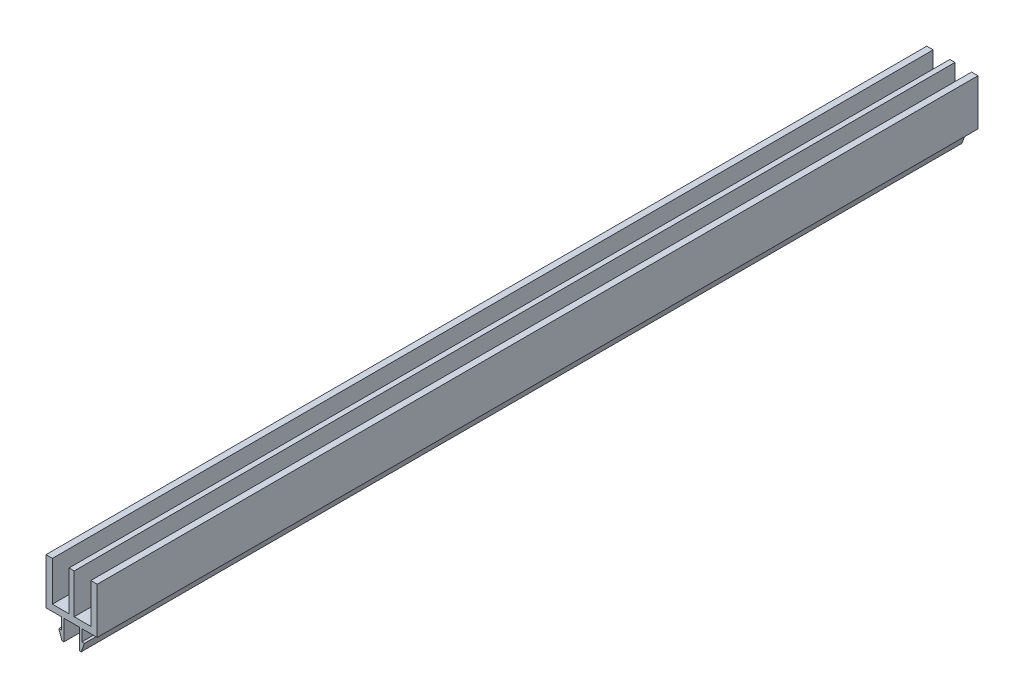
ISO-10303-21;
HEADER;
FILE_DESCRIPTION(('STEP AP214'),'2;1');
FILE_NAME('part.step','',(''),(''),'','','');
FILE_SCHEMA(('AUTOMOTIVE_DESIGN { 1 0 10303 214 1 1 1 1 }'));
ENDSEC;
DATA;
#1=APPLICATION_CONTEXT('core data for automotive mechanical design processes');
#2=APPLICATION_PROTOCOL_DEFINITION('international standard','automotive_design',2000,#1);
#3=PRODUCT_CONTEXT('',#1,'mechanical');
#4=PRODUCT('Part','Part','',(#3));
#5=PRODUCT_RELATED_PRODUCT_CATEGORY('part','',(#4));
#6=PRODUCT_DEFINITION_FORMATION('','',#4);
#7=PRODUCT_DEFINITION_CONTEXT('part definition',#1,'design');
#8=PRODUCT_DEFINITION('design','',#6,#7);
#9=PRODUCT_DEFINITION_SHAPE('','',#8);
#10=(LENGTH_UNIT() NAMED_UNIT(*) SI_UNIT(.MILLI.,.METRE.));
#11=(NAMED_UNIT(*) PLANE_ANGLE_UNIT() SI_UNIT($,.RADIAN.));
#12=(NAMED_UNIT(*) SI_UNIT($,.STERADIAN.) SOLID_ANGLE_UNIT());
#13=UNCERTAINTY_MEASURE_WITH_UNIT(LENGTH_MEASURE(1.E-05),#10,'distance_accuracy_value','');
#14=(GEOMETRIC_REPRESENTATION_CONTEXT(3) GLOBAL_UNCERTAINTY_ASSIGNED_CONTEXT((#13)) GLOBAL_UNIT_ASSIGNED_CONTEXT((#10,
#11,#12)) REPRESENTATION_CONTEXT('',''));
#15=CARTESIAN_POINT('',(0.,0.,0.));
#16=DIRECTION('',(0.,0.,1.));
#17=DIRECTION('',(1.,0.,0.));
#18=AXIS2_PLACEMENT_3D('',#15,#16,#17);
#19=CARTESIAN_POINT('',(-1.,17.9999999975,-294.));
#20=DIRECTION('',(-1.,0.,0.));
#21=DIRECTION('',(0.,-1.,0.));
#22=AXIS2_PLACEMENT_3D('',#19,#20,#21);
#23=PLANE('',#22);
#24=DIRECTION('',(0.,-1.,0.));
#25=VECTOR('',#24,1.);
#26=CARTESIAN_POINT('',(-1.,17.9999999975,50.));
#27=LINE('',#26,#25);
#28=CARTESIAN_POINT('',(-1.,17.9999999975,50.));
#29=VERTEX_POINT('',#28);
#30=CARTESIAN_POINT('',(-1.,2.4999999995,50.));
#31=VERTEX_POINT('',#30);
#32=EDGE_CURVE('E225',#29,#31,#27,.T.);
#33=ORIENTED_EDGE('',*,*,#32,.F.);
#34=DIRECTION('',(0.,0.,1.));
#35=VECTOR('',#34,1.);
#36=CARTESIAN_POINT('',(-1.,17.9999999975,-294.));
#37=LINE('',#36,#35);
#38=CARTESIAN_POINT('',(-1.,17.9999999975,-294.));
#39=VERTEX_POINT('',#38);
#40=EDGE_CURVE('E11',#39,#29,#37,.T.);
#41=ORIENTED_EDGE('',*,*,#40,.F.);
#42=DIRECTION('',(0.,-1.,0.));
#43=VECTOR('',#42,1.);
#44=CARTESIAN_POINT('',(-1.,17.9999999975,-294.));
#45=LINE('',#44,#43);
#46=CARTESIAN_POINT('',(-1.,2.4999999995,-294.));
#47=VERTEX_POINT('',#46);
#48=EDGE_CURVE('E293',#39,#47,#45,.T.);
#49=ORIENTED_EDGE('',*,*,#48,.T.);
#50=DIRECTION('',(0.,0.,1.));
#51=VECTOR('',#50,1.);
#52=CARTESIAN_POINT('',(-1.,2.4999999995,-294.));
#53=LINE('',#52,#51);
#54=EDGE_CURVE('E35',#47,#31,#53,.T.);
#55=ORIENTED_EDGE('',*,*,#54,.T.);
#56=EDGE_LOOP('',(#33,#41,#49,#55));
#57=FACE_BOUND('',#56,.T.);
#58=ADVANCED_FACE('F32',(#57),#23,.T.);
#59=CARTESIAN_POINT('',(0.999999999999998,17.9999999975,-294.));
#60=DIRECTION('',(0.,1.,0.));
#61=DIRECTION('',(0.,0.,1.));
#62=AXIS2_PLACEMENT_3D('',#59,#60,#61);
#63=PLANE('',#62);
#64=DIRECTION('',(-1.,0.,0.));
#65=VECTOR('',#64,1.);
#66=CARTESIAN_POINT('',(0.999999999999998,17.9999999975,50.));
#67=LINE('',#66,#65);
#68=CARTESIAN_POINT('',(0.999999999999998,17.9999999975,50.));
#69=VERTEX_POINT('',#68);
#70=EDGE_CURVE('E291',#69,#29,#67,.T.);
#71=ORIENTED_EDGE('',*,*,#70,.F.);
#72=DIRECTION('',(0.,0.,1.));
#73=VECTOR('',#72,1.);
#74=CARTESIAN_POINT('',(0.999999999999998,17.9999999975,-294.));
#75=LINE('',#74,#73);
#76=CARTESIAN_POINT('',(0.999999999999998,17.9999999975,-294.));
#77=VERTEX_POINT('',#76);
#78=EDGE_CURVE('E41',#77,#69,#75,.T.);
#79=ORIENTED_EDGE('',*,*,#78,.F.);
#80=DIRECTION('',(-1.,0.,0.));
#81=VECTOR('',#80,1.);
#82=CARTESIAN_POINT('',(0.999999999999998,17.9999999975,-294.));
#83=LINE('',#82,#81);
#84=EDGE_CURVE('E215',#77,#39,#83,.T.);
#85=ORIENTED_EDGE('',*,*,#84,.T.);
#86=ORIENTED_EDGE('',*,*,#40,.T.);
#87=EDGE_LOOP('',(#71,#79,#85,#86));
#88=FACE_BOUND('',#87,.T.);
#89=ADVANCED_FACE('F337',(#88),#63,.T.);
#90=CARTESIAN_POINT('',(0.999999999999998,2.4999999995,-294.));
#91=DIRECTION('',(1.,0.,0.));
#92=DIRECTION('',(0.,0.,-1.));
#93=AXIS2_PLACEMENT_3D('',#90,#91,#92);
#94=PLANE('',#93);
#95=DIRECTION('',(0.,1.,0.));
#96=VECTOR('',#95,1.);
#97=CARTESIAN_POINT('',(0.999999999999998,2.4999999995,50.));
#98=LINE('',#97,#96);
#99=CARTESIAN_POINT('',(0.999999999999998,2.4999999995,50.));
#100=VERTEX_POINT('',#99);
#101=EDGE_CURVE('E202',#100,#69,#98,.T.);
#102=ORIENTED_EDGE('',*,*,#101,.F.);
#103=DIRECTION('',(0.,0.,1.));
#104=VECTOR('',#103,1.);
#105=CARTESIAN_POINT('',(0.999999999999998,2.4999999995,-294.));
#106=LINE('',#105,#104);
#107=CARTESIAN_POINT('',(0.999999999999998,2.4999999995,-294.));
#108=VERTEX_POINT('',#107);
#109=EDGE_CURVE('E197',#108,#100,#106,.T.);
#110=ORIENTED_EDGE('',*,*,#109,.F.);
#111=DIRECTION('',(0.,1.,0.));
#112=VECTOR('',#111,1.);
#113=CARTESIAN_POINT('',(0.999999999999998,2.4999999995,-294.));
#114=LINE('',#113,#112);
#115=EDGE_CURVE('E200',#108,#77,#114,.T.);
#116=ORIENTED_EDGE('',*,*,#115,.T.);
#117=ORIENTED_EDGE('',*,*,#78,.T.);
#118=EDGE_LOOP('',(#102,#110,#116,#117));
#119=FACE_BOUND('',#118,.T.);
#120=ADVANCED_FACE('F199',(#119),#94,.T.);
#121=CARTESIAN_POINT('',(7.5,2.4999999995,-294.));
#122=DIRECTION('',(0.,1.,0.));
#123=DIRECTION('',(-1.,0.,0.));
#124=AXIS2_PLACEMENT_3D('',#121,#122,#123);
#125=PLANE('',#124);
#126=DIRECTION('',(-1.,0.,0.));
#127=VECTOR('',#126,1.);
#128=CARTESIAN_POINT('',(7.5,2.4999999995,50.));
#129=LINE('',#128,#127);
#130=CARTESIAN_POINT('',(7.5,2.4999999995,50.));
#131=VERTEX_POINT('',#130);
#132=EDGE_CURVE('E288',#131,#100,#129,.T.);
#133=ORIENTED_EDGE('',*,*,#132,.F.);
#134=DIRECTION('',(0.,0.,1.));
#135=VECTOR('',#134,1.);
#136=CARTESIAN_POINT('',(7.5,2.4999999995,-294.));
#137=LINE('',#136,#135);
#138=CARTESIAN_POINT('',(7.5,2.4999999995,-294.));
#139=VERTEX_POINT('',#138);
#140=EDGE_CURVE('E207',#139,#131,#137,.T.);
#141=ORIENTED_EDGE('',*,*,#140,.F.);
#142=DIRECTION('',(-1.,0.,0.));
#143=VECTOR('',#142,1.);
#144=CARTESIAN_POINT('',(7.5,2.4999999995,-294.));
#145=LINE('',#144,#143);
#146=EDGE_CURVE('E213',#139,#108,#145,.T.);
#147=ORIENTED_EDGE('',*,*,#146,.T.);
#148=ORIENTED_EDGE('',*,*,#109,.T.);
#149=EDGE_LOOP('',(#133,#141,#147,#148));
#150=FACE_BOUND('',#149,.T.);
#151=ADVANCED_FACE('F217',(#150),#125,.T.);
#152=CARTESIAN_POINT('',(7.5,17.9999999975,-294.));
#153=DIRECTION('',(-1.,0.,0.));
#154=DIRECTION('',(0.,-1.,0.));
#155=AXIS2_PLACEMENT_3D('',#152,#153,#154);
#156=PLANE('',#155);
#157=DIRECTION('',(0.,-1.,0.));
#158=VECTOR('',#157,1.);
#159=CARTESIAN_POINT('',(7.5,17.9999999975,50.));
#160=LINE('',#159,#158);
#161=CARTESIAN_POINT('',(7.5,17.9999999975,50.));
#162=VERTEX_POINT('',#161);
#163=EDGE_CURVE('E285',#162,#131,#160,.T.);
#164=ORIENTED_EDGE('',*,*,#163,.F.);
#165=DIRECTION('',(0.,0.,1.));
#166=VECTOR('',#165,1.);
#167=CARTESIAN_POINT('',(7.5,17.9999999975,-294.));
#168=LINE('',#167,#166);
#169=CARTESIAN_POINT('',(7.5,17.9999999975,-294.));
#170=VERTEX_POINT('',#169);
#171=EDGE_CURVE('E297',#170,#162,#168,.T.);
#172=ORIENTED_EDGE('',*,*,#171,.F.);
#173=DIRECTION('',(0.,-1.,0.));
#174=VECTOR('',#173,1.);
#175=CARTESIAN_POINT('',(7.5,17.9999999975,-294.));
#176=LINE('',#175,#174);
#177=EDGE_CURVE('E218',#170,#139,#176,.T.);
#178=ORIENTED_EDGE('',*,*,#177,.T.);
#179=ORIENTED_EDGE('',*,*,#140,.T.);
#180=EDGE_LOOP('',(#164,#172,#178,#179));
#181=FACE_BOUND('',#180,.T.);
#182=ADVANCED_FACE('F350',(#181),#156,.T.);
#183=CARTESIAN_POINT('',(10.,17.9999999975,-294.));
#184=DIRECTION('',(0.,1.,0.));
#185=DIRECTION('',(0.,0.,1.));
#186=AXIS2_PLACEMENT_3D('',#183,#184,#185);
#187=PLANE('',#186);
#188=DIRECTION('',(-1.,0.,0.));
#189=VECTOR('',#188,1.);
#190=CARTESIAN_POINT('',(10.,17.9999999975,50.));
#191=LINE('',#190,#189);
#192=CARTESIAN_POINT('',(10.,17.9999999975,50.));
#193=VERTEX_POINT('',#192);
#194=EDGE_CURVE('E282',#193,#162,#191,.T.);
#195=ORIENTED_EDGE('',*,*,#194,.F.);
#196=DIRECTION('',(0.,0.,1.));
#197=VECTOR('',#196,1.);
#198=CARTESIAN_POINT('',(10.,17.9999999975,-294.));
#199=LINE('',#198,#197);
#200=CARTESIAN_POINT('',(10.,17.9999999975,-294.));
#201=VERTEX_POINT('',#200);
#202=EDGE_CURVE('E299',#201,#193,#199,.T.);
#203=ORIENTED_EDGE('',*,*,#202,.F.);
#204=DIRECTION('',(-1.,0.,0.));
#205=VECTOR('',#204,1.);
#206=CARTESIAN_POINT('',(10.,17.9999999975,-294.));
#207=LINE('',#206,#205);
#208=EDGE_CURVE('E220',#201,#170,#207,.T.);
#209=ORIENTED_EDGE('',*,*,#208,.T.);
#210=ORIENTED_EDGE('',*,*,#171,.T.);
#211=EDGE_LOOP('',(#195,#203,#209,#210));
#212=FACE_BOUND('',#211,.T.);
#213=ADVANCED_FACE('F353',(#212),#187,.T.);
#214=CARTESIAN_POINT('',(10.,-4.99999828349541E-10,-294.));
#215=DIRECTION('',(1.,0.,0.));
#216=DIRECTION('',(0.,0.,-1.));
#217=AXIS2_PLACEMENT_3D('',#214,#215,#216);
#218=PLANE('',#217);
#219=DIRECTION('',(0.,1.,0.));
#220=VECTOR('',#219,1.);
#221=CARTESIAN_POINT('',(10.,-4.99999828349541E-10,50.));
#222=LINE('',#221,#220);
#223=CARTESIAN_POINT('',(10.,-4.99999828349541E-10,50.));
#224=VERTEX_POINT('',#223);
#225=EDGE_CURVE('E279',#224,#193,#222,.T.);
#226=ORIENTED_EDGE('',*,*,#225,.F.);
#227=DIRECTION('',(0.,0.,1.));
#228=VECTOR('',#227,1.);
#229=CARTESIAN_POINT('',(10.,-4.99999828349541E-10,-294.));
#230=LINE('',#229,#228);
#231=CARTESIAN_POINT('',(10.,-4.99999828349541E-10,-294.));
#232=VERTEX_POINT('',#231);
#233=EDGE_CURVE('E301',#232,#224,#230,.T.);
#234=ORIENTED_EDGE('',*,*,#233,.F.);
#235=DIRECTION('',(0.,1.,0.));
#236=VECTOR('',#235,1.);
#237=CARTESIAN_POINT('',(10.,-4.99999828349541E-10,-294.));
#238=LINE('',#237,#236);
#239=EDGE_CURVE('E643',#232,#201,#238,.T.);
#240=ORIENTED_EDGE('',*,*,#239,.T.);
#241=ORIENTED_EDGE('',*,*,#202,.T.);
#242=EDGE_LOOP('',(#226,#234,#240,#241));
#243=FACE_BOUND('',#242,.T.);
#244=ADVANCED_FACE('F357',(#243),#218,.T.);
#245=CARTESIAN_POINT('',(4.,-4.99999998002099E-10,-294.));
#246=DIRECTION('',(0.,-1.,0.));
#247=DIRECTION('',(1.,0.,0.));
#248=AXIS2_PLACEMENT_3D('',#245,#246,#247);
#249=PLANE('',#248);
#250=DIRECTION('',(1.,0.,0.));
#251=VECTOR('',#250,1.);
#252=CARTESIAN_POINT('',(4.,-4.99999998002099E-10,50.));
#253=LINE('',#252,#251);
#254=CARTESIAN_POINT('',(4.,-4.99999998002099E-10,50.));
#255=VERTEX_POINT('',#254);
#256=EDGE_CURVE('E276',#255,#224,#253,.T.);
#257=ORIENTED_EDGE('',*,*,#256,.F.);
#258=DIRECTION('',(0.,0.,1.));
#259=VECTOR('',#258,1.);
#260=CARTESIAN_POINT('',(4.,-4.99999998002099E-10,-294.));
#261=LINE('',#260,#259);
#262=CARTESIAN_POINT('',(4.,-4.99999998002099E-10,-294.));
#263=VERTEX_POINT('',#262);
#264=EDGE_CURVE('E303',#263,#255,#261,.T.);
#265=ORIENTED_EDGE('',*,*,#264,.F.);
#266=DIRECTION('',(1.,0.,0.));
#267=VECTOR('',#266,1.);
#268=CARTESIAN_POINT('',(4.,-4.99999998002099E-10,-294.));
#269=LINE('',#268,#267);
#270=EDGE_CURVE('E647',#263,#232,#269,.T.);
#271=ORIENTED_EDGE('',*,*,#270,.T.);
#272=ORIENTED_EDGE('',*,*,#233,.T.);
#273=EDGE_LOOP('',(#257,#265,#271,#272));
#274=FACE_BOUND('',#273,.T.);
#275=ADVANCED_FACE('F361',(#274),#249,.T.);
#276=CARTESIAN_POINT('',(4.,-4.5,-294.));
#277=DIRECTION('',(1.,0.,0.));
#278=DIRECTION('',(0.,0.,-1.));
#279=AXIS2_PLACEMENT_3D('',#276,#277,#278);
#280=PLANE('',#279);
#281=DIRECTION('',(0.,1.,0.));
#282=VECTOR('',#281,1.);
#283=CARTESIAN_POINT('',(4.,-4.5,50.));
#284=LINE('',#283,#282);
#285=CARTESIAN_POINT('',(4.,-4.5,50.));
#286=VERTEX_POINT('',#285);
#287=EDGE_CURVE('E273',#286,#255,#284,.T.);
#288=ORIENTED_EDGE('',*,*,#287,.F.);
#289=DIRECTION('',(0.,0.,1.));
#290=VECTOR('',#289,1.);
#291=CARTESIAN_POINT('',(4.,-4.5,-294.));
#292=LINE('',#291,#290);
#293=CARTESIAN_POINT('',(4.,-4.5,-294.));
#294=VERTEX_POINT('',#293);
#295=EDGE_CURVE('E305',#294,#286,#292,.T.);
#296=ORIENTED_EDGE('',*,*,#295,.F.);
#297=DIRECTION('',(0.,1.,0.));
#298=VECTOR('',#297,1.);
#299=CARTESIAN_POINT('',(4.,-4.5,-294.));
#300=LINE('',#299,#298);
#301=EDGE_CURVE('E636',#294,#263,#300,.T.);
#302=ORIENTED_EDGE('',*,*,#301,.T.);
#303=ORIENTED_EDGE('',*,*,#264,.T.);
#304=EDGE_LOOP('',(#288,#296,#302,#303));
#305=FACE_BOUND('',#304,.T.);
#306=ADVANCED_FACE('F365',(#305),#280,.T.);
#307=CARTESIAN_POINT('',(5.,-4.5,-294.));
#308=DIRECTION('',(0.,1.,0.));
#309=DIRECTION('',(0.,0.,1.));
#310=AXIS2_PLACEMENT_3D('',#307,#308,#309);
#311=PLANE('',#310);
#312=DIRECTION('',(-1.,0.,0.));
#313=VECTOR('',#312,1.);
#314=CARTESIAN_POINT('',(5.,-4.5,50.));
#315=LINE('',#314,#313);
#316=CARTESIAN_POINT('',(5.,-4.5,50.));
#317=VERTEX_POINT('',#316);
#318=EDGE_CURVE('E270',#317,#286,#315,.T.);
#319=ORIENTED_EDGE('',*,*,#318,.F.);
#320=DIRECTION('',(0.,0.,1.));
#321=VECTOR('',#320,1.);
#322=CARTESIAN_POINT('',(5.,-4.5,-294.));
#323=LINE('',#322,#321);
#324=CARTESIAN_POINT('',(5.,-4.5,-294.));
#325=VERTEX_POINT('',#324);
#326=EDGE_CURVE('E307',#325,#317,#323,.T.);
#327=ORIENTED_EDGE('',*,*,#326,.F.);
#328=DIRECTION('',(-1.,0.,0.));
#329=VECTOR('',#328,1.);
#330=CARTESIAN_POINT('',(5.,-4.5,-294.));
#331=LINE('',#330,#329);
#332=EDGE_CURVE('E632',#325,#294,#331,.T.);
#333=ORIENTED_EDGE('',*,*,#332,.T.);
#334=ORIENTED_EDGE('',*,*,#295,.T.);
#335=EDGE_LOOP('',(#319,#327,#333,#334));
#336=FACE_BOUND('',#335,.T.);
#337=ADVANCED_FACE('F369',(#336),#311,.T.);
#338=CARTESIAN_POINT('',(3.75,-8.,-294.));
#339=DIRECTION('',(0.941741911594837,-0.336336396998156,0.));
#340=DIRECTION('',(0.336336396998157,0.941741911594838,0.));
#341=AXIS2_PLACEMENT_3D('',#338,#339,#340);
#342=PLANE('',#341);
#343=DIRECTION('',(0.336336396998157,0.941741911594837,0.));
#344=VECTOR('',#343,1.);
#345=CARTESIAN_POINT('',(3.75,-8.,50.));
#346=LINE('',#345,#344);
#347=CARTESIAN_POINT('',(3.75,-8.,50.));
#348=VERTEX_POINT('',#347);
#349=EDGE_CURVE('E267',#348,#317,#346,.T.);
#350=ORIENTED_EDGE('',*,*,#349,.F.);
#351=DIRECTION('',(0.,0.,1.));
#352=VECTOR('',#351,1.);
#353=CARTESIAN_POINT('',(3.75,-8.,-294.));
#354=LINE('',#353,#352);
#355=CARTESIAN_POINT('',(3.75,-8.,-294.));
#356=VERTEX_POINT('',#355);
#357=EDGE_CURVE('E309',#356,#348,#354,.T.);
#358=ORIENTED_EDGE('',*,*,#357,.F.);
#359=DIRECTION('',(0.336336396998157,0.941741911594837,0.));
#360=VECTOR('',#359,1.);
#361=CARTESIAN_POINT('',(3.75,-8.,-294.));
#362=LINE('',#361,#360);
#363=EDGE_CURVE('E653',#356,#325,#362,.T.);
#364=ORIENTED_EDGE('',*,*,#363,.T.);
#365=ORIENTED_EDGE('',*,*,#326,.T.);
#366=EDGE_LOOP('',(#350,#358,#364,#365));
#367=FACE_BOUND('',#366,.T.);
#368=ADVANCED_FACE('F373',(#367),#342,.T.);
#369=CARTESIAN_POINT('',(3.,-8.,-294.));
#370=DIRECTION('',(0.,-1.,0.));
#371=DIRECTION('',(0.,0.,-1.));
#372=AXIS2_PLACEMENT_3D('',#369,#370,#371);
#373=PLANE('',#372);
#374=DIRECTION('',(1.,0.,0.));
#375=VECTOR('',#374,1.);
#376=CARTESIAN_POINT('',(3.,-8.,50.));
#377=LINE('',#376,#375);
#378=CARTESIAN_POINT('',(3.,-8.,50.));
#379=VERTEX_POINT('',#378);
#380=EDGE_CURVE('E264',#379,#348,#377,.T.);
#381=ORIENTED_EDGE('',*,*,#380,.F.);
#382=DIRECTION('',(0.,0.,1.));
#383=VECTOR('',#382,1.);
#384=CARTESIAN_POINT('',(3.,-8.,-294.));
#385=LINE('',#384,#383);
#386=CARTESIAN_POINT('',(3.,-8.,-294.));
#387=VERTEX_POINT('',#386);
#388=EDGE_CURVE('E311',#387,#379,#385,.T.);
#389=ORIENTED_EDGE('',*,*,#388,.F.);
#390=DIRECTION('',(1.,0.,0.));
#391=VECTOR('',#390,1.);
#392=CARTESIAN_POINT('',(3.,-8.,-294.));
#393=LINE('',#392,#391);
#394=EDGE_CURVE('E625',#387,#356,#393,.T.);
#395=ORIENTED_EDGE('',*,*,#394,.T.);
#396=ORIENTED_EDGE('',*,*,#357,.T.);
#397=EDGE_LOOP('',(#381,#389,#395,#396));
#398=FACE_BOUND('',#397,.T.);
#399=ADVANCED_FACE('F377',(#398),#373,.T.);
#400=CARTESIAN_POINT('',(3.,-4.9999985194348E-10,-294.));
#401=DIRECTION('',(-1.,0.,0.));
#402=DIRECTION('',(0.,0.,1.));
#403=AXIS2_PLACEMENT_3D('',#400,#401,#402);
#404=PLANE('',#403);
#405=DIRECTION('',(0.,-1.,0.));
#406=VECTOR('',#405,1.);
#407=CARTESIAN_POINT('',(3.,-4.9999985194348E-10,50.));
#408=LINE('',#407,#406);
#409=CARTESIAN_POINT('',(3.,-4.9999985194348E-10,50.));
#410=VERTEX_POINT('',#409);
#411=EDGE_CURVE('E261',#410,#379,#408,.T.);
#412=ORIENTED_EDGE('',*,*,#411,.F.);
#413=DIRECTION('',(0.,0.,1.));
#414=VECTOR('',#413,1.);
#415=CARTESIAN_POINT('',(3.,-4.9999985194348E-10,-294.));
#416=LINE('',#415,#414);
#417=CARTESIAN_POINT('',(3.,-4.9999985194348E-10,-294.));
#418=VERTEX_POINT('',#417);
#419=EDGE_CURVE('E313',#418,#410,#416,.T.);
#420=ORIENTED_EDGE('',*,*,#419,.F.);
#421=DIRECTION('',(0.,-1.,0.));
#422=VECTOR('',#421,1.);
#423=CARTESIAN_POINT('',(3.,-4.9999985194348E-10,-294.));
#424=LINE('',#423,#422);
#425=EDGE_CURVE('E621',#418,#387,#424,.T.);
#426=ORIENTED_EDGE('',*,*,#425,.T.);
#427=ORIENTED_EDGE('',*,*,#388,.T.);
#428=EDGE_LOOP('',(#412,#420,#426,#427));
#429=FACE_BOUND('',#428,.T.);
#430=ADVANCED_FACE('F381',(#429),#404,.T.);
#431=CARTESIAN_POINT('',(-3.,-4.99999455901012E-10,-294.));
#432=DIRECTION('',(0.,-1.,0.));
#433=DIRECTION('',(1.,0.,0.));
#434=AXIS2_PLACEMENT_3D('',#431,#432,#433);
#435=PLANE('',#434);
#436=DIRECTION('',(1.,0.,0.));
#437=VECTOR('',#436,1.);
#438=CARTESIAN_POINT('',(-3.,-4.99999455901012E-10,50.));
#439=LINE('',#438,#437);
#440=CARTESIAN_POINT('',(-3.,-4.99999455901012E-10,50.));
#441=VERTEX_POINT('',#440);
#442=EDGE_CURVE('E258',#441,#410,#439,.T.);
#443=ORIENTED_EDGE('',*,*,#442,.F.);
#444=DIRECTION('',(0.,0.,1.));
#445=VECTOR('',#444,1.);
#446=CARTESIAN_POINT('',(-3.,-4.99999455901012E-10,-294.));
#447=LINE('',#446,#445);
#448=CARTESIAN_POINT('',(-3.,-4.99999455901012E-10,-294.));
#449=VERTEX_POINT('',#448);
#450=EDGE_CURVE('E315',#449,#441,#447,.T.);
#451=ORIENTED_EDGE('',*,*,#450,.F.);
#452=DIRECTION('',(1.,0.,0.));
#453=VECTOR('',#452,1.);
#454=CARTESIAN_POINT('',(-3.,-4.99999455901012E-10,-294.));
#455=LINE('',#454,#453);
#456=EDGE_CURVE('E657',#449,#418,#455,.T.);
#457=ORIENTED_EDGE('',*,*,#456,.T.);
#458=ORIENTED_EDGE('',*,*,#419,.T.);
#459=EDGE_LOOP('',(#443,#451,#457,#458));
#460=FACE_BOUND('',#459,.T.);
#461=ADVANCED_FACE('F385',(#460),#435,.T.);
#462=CARTESIAN_POINT('',(-3.,-8.,-294.));
#463=DIRECTION('',(1.,0.,0.));
#464=DIRECTION('',(0.,0.,-1.));
#465=AXIS2_PLACEMENT_3D('',#462,#463,#464);
#466=PLANE('',#465);
#467=DIRECTION('',(0.,1.,0.));
#468=VECTOR('',#467,1.);
#469=CARTESIAN_POINT('',(-3.,-8.,50.));
#470=LINE('',#469,#468);
#471=CARTESIAN_POINT('',(-3.,-8.,50.));
#472=VERTEX_POINT('',#471);
#473=EDGE_CURVE('E255',#472,#441,#470,.T.);
#474=ORIENTED_EDGE('',*,*,#473,.F.);
#475=DIRECTION('',(0.,0.,1.));
#476=VECTOR('',#475,1.);
#477=CARTESIAN_POINT('',(-3.,-8.,-294.));
#478=LINE('',#477,#476);
#479=CARTESIAN_POINT('',(-3.,-8.,-294.));
#480=VERTEX_POINT('',#479);
#481=EDGE_CURVE('E317',#480,#472,#478,.T.);
#482=ORIENTED_EDGE('',*,*,#481,.F.);
#483=DIRECTION('',(0.,1.,0.));
#484=VECTOR('',#483,1.);
#485=CARTESIAN_POINT('',(-3.,-8.,-294.));
#486=LINE('',#485,#484);
#487=EDGE_CURVE('E614',#480,#449,#486,.T.);
#488=ORIENTED_EDGE('',*,*,#487,.T.);
#489=ORIENTED_EDGE('',*,*,#450,.T.);
#490=EDGE_LOOP('',(#474,#482,#488,#489));
#491=FACE_BOUND('',#490,.T.);
#492=ADVANCED_FACE('F389',(#491),#466,.T.);
#493=CARTESIAN_POINT('',(-3.75,-8.,-294.));
#494=DIRECTION('',(0.,-1.,0.));
#495=DIRECTION('',(0.,0.,-1.));
#496=AXIS2_PLACEMENT_3D('',#493,#494,#495);
#497=PLANE('',#496);
#498=DIRECTION('',(1.,0.,0.));
#499=VECTOR('',#498,1.);
#500=CARTESIAN_POINT('',(-3.75,-8.,50.));
#501=LINE('',#500,#499);
#502=CARTESIAN_POINT('',(-3.75,-8.,50.));
#503=VERTEX_POINT('',#502);
#504=EDGE_CURVE('E252',#503,#472,#501,.T.);
#505=ORIENTED_EDGE('',*,*,#504,.F.);
#506=DIRECTION('',(0.,0.,1.));
#507=VECTOR('',#506,1.);
#508=CARTESIAN_POINT('',(-3.75,-8.,-294.));
#509=LINE('',#508,#507);
#510=CARTESIAN_POINT('',(-3.75,-8.,-294.));
#511=VERTEX_POINT('',#510);
#512=EDGE_CURVE('E319',#511,#503,#509,.T.);
#513=ORIENTED_EDGE('',*,*,#512,.F.);
#514=DIRECTION('',(1.,0.,0.));
#515=VECTOR('',#514,1.);
#516=CARTESIAN_POINT('',(-3.75,-8.,-294.));
#517=LINE('',#516,#515);
#518=EDGE_CURVE('E610',#511,#480,#517,.T.);
#519=ORIENTED_EDGE('',*,*,#518,.T.);
#520=ORIENTED_EDGE('',*,*,#481,.T.);
#521=EDGE_LOOP('',(#505,#513,#519,#520));
#522=FACE_BOUND('',#521,.T.);
#523=ADVANCED_FACE('F393',(#522),#497,.T.);
#524=CARTESIAN_POINT('',(-5.,-4.5,-294.));
#525=DIRECTION('',(-0.941741911594837,-0.336336396998156,0.));
#526=DIRECTION('',(0.336336396998156,-0.941741911594837,0.));
#527=AXIS2_PLACEMENT_3D('',#524,#525,#526);
#528=PLANE('',#527);
#529=DIRECTION('',(0.336336396998156,-0.941741911594837,0.));
#530=VECTOR('',#529,1.);
#531=CARTESIAN_POINT('',(-5.,-4.5,50.));
#532=LINE('',#531,#530);
#533=CARTESIAN_POINT('',(-5.,-4.5,50.));
#534=VERTEX_POINT('',#533);
#535=EDGE_CURVE('E249',#534,#503,#532,.T.);
#536=ORIENTED_EDGE('',*,*,#535,.F.);
#537=DIRECTION('',(0.,0.,1.));
#538=VECTOR('',#537,1.);
#539=CARTESIAN_POINT('',(-5.,-4.5,-294.));
#540=LINE('',#539,#538);
#541=CARTESIAN_POINT('',(-5.,-4.5,-294.));
#542=VERTEX_POINT('',#541);
#543=EDGE_CURVE('E321',#542,#534,#540,.T.);
#544=ORIENTED_EDGE('',*,*,#543,.F.);
#545=DIRECTION('',(0.336336396998156,-0.941741911594837,0.));
#546=VECTOR('',#545,1.);
#547=CARTESIAN_POINT('',(-5.,-4.5,-294.));
#548=LINE('',#547,#546);
#549=EDGE_CURVE('E661',#542,#511,#548,.T.);
#550=ORIENTED_EDGE('',*,*,#549,.T.);
#551=ORIENTED_EDGE('',*,*,#512,.T.);
#552=EDGE_LOOP('',(#536,#544,#550,#551));
#553=FACE_BOUND('',#552,.T.);
#554=ADVANCED_FACE('F397',(#553),#528,.T.);
#555=CARTESIAN_POINT('',(-4.,-4.5,-294.));
#556=DIRECTION('',(0.,1.,0.));
#557=DIRECTION('',(0.,0.,1.));
#558=AXIS2_PLACEMENT_3D('',#555,#556,#557);
#559=PLANE('',#558);
#560=DIRECTION('',(-1.,0.,0.));
#561=VECTOR('',#560,1.);
#562=CARTESIAN_POINT('',(-4.,-4.5,50.));
#563=LINE('',#562,#561);
#564=CARTESIAN_POINT('',(-4.,-4.5,50.));
#565=VERTEX_POINT('',#564);
#566=EDGE_CURVE('E246',#565,#534,#563,.T.);
#567=ORIENTED_EDGE('',*,*,#566,.F.);
#568=DIRECTION('',(0.,0.,1.));
#569=VECTOR('',#568,1.);
#570=CARTESIAN_POINT('',(-4.,-4.5,-294.));
#571=LINE('',#570,#569);
#572=CARTESIAN_POINT('',(-4.,-4.5,-294.));
#573=VERTEX_POINT('',#572);
#574=EDGE_CURVE('E323',#573,#565,#571,.T.);
#575=ORIENTED_EDGE('',*,*,#574,.F.);
#576=DIRECTION('',(-1.,0.,0.));
#577=VECTOR('',#576,1.);
#578=CARTESIAN_POINT('',(-4.,-4.5,-294.));
#579=LINE('',#578,#577);
#580=EDGE_CURVE('E603',#573,#542,#579,.T.);
#581=ORIENTED_EDGE('',*,*,#580,.T.);
#582=ORIENTED_EDGE('',*,*,#543,.T.);
#583=EDGE_LOOP('',(#567,#575,#581,#582));
#584=FACE_BOUND('',#583,.T.);
#585=ADVANCED_FACE('F401',(#584),#559,.T.);
#586=CARTESIAN_POINT('',(-4.,-4.9999985194348E-10,-294.));
#587=DIRECTION('',(-1.,0.,0.));
#588=DIRECTION('',(0.,0.,1.));
#589=AXIS2_PLACEMENT_3D('',#586,#587,#588);
#590=PLANE('',#589);
#591=DIRECTION('',(0.,-1.,0.));
#592=VECTOR('',#591,1.);
#593=CARTESIAN_POINT('',(-4.,-4.9999985194348E-10,50.));
#594=LINE('',#593,#592);
#595=CARTESIAN_POINT('',(-4.,-4.9999985194348E-10,50.));
#596=VERTEX_POINT('',#595);
#597=EDGE_CURVE('E243',#596,#565,#594,.T.);
#598=ORIENTED_EDGE('',*,*,#597,.F.);
#599=DIRECTION('',(0.,0.,1.));
#600=VECTOR('',#599,1.);
#601=CARTESIAN_POINT('',(-4.,-4.9999985194348E-10,-294.));
#602=LINE('',#601,#600);
#603=CARTESIAN_POINT('',(-4.,-4.9999985194348E-10,-294.));
#604=VERTEX_POINT('',#603);
#605=EDGE_CURVE('E325',#604,#596,#602,.T.);
#606=ORIENTED_EDGE('',*,*,#605,.F.);
#607=DIRECTION('',(0.,-1.,0.));
#608=VECTOR('',#607,1.);
#609=CARTESIAN_POINT('',(-4.,-4.9999985194348E-10,-294.));
#610=LINE('',#609,#608);
#611=EDGE_CURVE('E599',#604,#573,#610,.T.);
#612=ORIENTED_EDGE('',*,*,#611,.T.);
#613=ORIENTED_EDGE('',*,*,#574,.T.);
#614=EDGE_LOOP('',(#598,#606,#612,#613));
#615=FACE_BOUND('',#614,.T.);
#616=ADVANCED_FACE('F405',(#615),#590,.T.);
#617=CARTESIAN_POINT('',(-10.,-4.99999719929324E-10,-294.));
#618=DIRECTION('',(0.,-1.,0.));
#619=DIRECTION('',(1.,0.,0.));
#620=AXIS2_PLACEMENT_3D('',#617,#618,#619);
#621=PLANE('',#620);
#622=DIRECTION('',(1.,0.,0.));
#623=VECTOR('',#622,1.);
#624=CARTESIAN_POINT('',(-10.,-4.99999719929324E-10,50.));
#625=LINE('',#624,#623);
#626=CARTESIAN_POINT('',(-10.,-4.99999719929324E-10,50.));
#627=VERTEX_POINT('',#626);
#628=EDGE_CURVE('E240',#627,#596,#625,.T.);
#629=ORIENTED_EDGE('',*,*,#628,.F.);
#630=DIRECTION('',(0.,0.,1.));
#631=VECTOR('',#630,1.);
#632=CARTESIAN_POINT('',(-10.,-4.99999719929324E-10,-294.));
#633=LINE('',#632,#631);
#634=CARTESIAN_POINT('',(-10.,-4.99999719929324E-10,-294.));
#635=VERTEX_POINT('',#634);
#636=EDGE_CURVE('E327',#635,#627,#633,.T.);
#637=ORIENTED_EDGE('',*,*,#636,.F.);
#638=DIRECTION('',(1.,0.,0.));
#639=VECTOR('',#638,1.);
#640=CARTESIAN_POINT('',(-10.,-4.99999719929324E-10,-294.));
#641=LINE('',#640,#639);
#642=EDGE_CURVE('E665',#635,#604,#641,.T.);
#643=ORIENTED_EDGE('',*,*,#642,.T.);
#644=ORIENTED_EDGE('',*,*,#605,.T.);
#645=EDGE_LOOP('',(#629,#637,#643,#644));
#646=FACE_BOUND('',#645,.T.);
#647=ADVANCED_FACE('F409',(#646),#621,.T.);
#648=CARTESIAN_POINT('',(-10.,17.9999999975,-294.));
#649=DIRECTION('',(-1.,0.,0.));
#650=DIRECTION('',(0.,-1.,0.));
#651=AXIS2_PLACEMENT_3D('',#648,#649,#650);
#652=PLANE('',#651);
#653=DIRECTION('',(0.,-1.,0.));
#654=VECTOR('',#653,1.);
#655=CARTESIAN_POINT('',(-10.,17.9999999975,50.));
#656=LINE('',#655,#654);
#657=CARTESIAN_POINT('',(-10.,17.9999999975,50.));
#658=VERTEX_POINT('',#657);
#659=EDGE_CURVE('E237',#658,#627,#656,.T.);
#660=ORIENTED_EDGE('',*,*,#659,.F.);
#661=DIRECTION('',(0.,0.,1.));
#662=VECTOR('',#661,1.);
#663=CARTESIAN_POINT('',(-10.,17.9999999975,-294.));
#664=LINE('',#663,#662);
#665=CARTESIAN_POINT('',(-10.,17.9999999975,-294.));
#666=VERTEX_POINT('',#665);
#667=EDGE_CURVE('E329',#666,#658,#664,.T.);
#668=ORIENTED_EDGE('',*,*,#667,.F.);
#669=DIRECTION('',(0.,-1.,0.));
#670=VECTOR('',#669,1.);
#671=CARTESIAN_POINT('',(-10.,17.9999999975,-294.));
#672=LINE('',#671,#670);
#673=EDGE_CURVE('E592',#666,#635,#672,.T.);
#674=ORIENTED_EDGE('',*,*,#673,.T.);
#675=ORIENTED_EDGE('',*,*,#636,.T.);
#676=EDGE_LOOP('',(#660,#668,#674,#675));
#677=FACE_BOUND('',#676,.T.);
#678=ADVANCED_FACE('F413',(#677),#652,.T.);
#679=CARTESIAN_POINT('',(-7.5,17.9999999975,-294.));
#680=DIRECTION('',(0.,1.,0.));
#681=DIRECTION('',(0.,0.,1.));
#682=AXIS2_PLACEMENT_3D('',#679,#680,#681);
#683=PLANE('',#682);
#684=DIRECTION('',(-1.,0.,0.));
#685=VECTOR('',#684,1.);
#686=CARTESIAN_POINT('',(-7.5,17.9999999975,50.));
#687=LINE('',#686,#685);
#688=CARTESIAN_POINT('',(-7.5,17.9999999975,50.));
#689=VERTEX_POINT('',#688);
#690=EDGE_CURVE('E234',#689,#658,#687,.T.);
#691=ORIENTED_EDGE('',*,*,#690,.F.);
#692=DIRECTION('',(0.,0.,1.));
#693=VECTOR('',#692,1.);
#694=CARTESIAN_POINT('',(-7.5,17.9999999975,-294.));
#695=LINE('',#694,#693);
#696=CARTESIAN_POINT('',(-7.5,17.9999999975,-294.));
#697=VERTEX_POINT('',#696);
#698=EDGE_CURVE('E331',#697,#689,#695,.T.);
#699=ORIENTED_EDGE('',*,*,#698,.F.);
#700=DIRECTION('',(-1.,0.,0.));
#701=VECTOR('',#700,1.);
#702=CARTESIAN_POINT('',(-7.5,17.9999999975,-294.));
#703=LINE('',#702,#701);
#704=EDGE_CURVE('E588',#697,#666,#703,.T.);
#705=ORIENTED_EDGE('',*,*,#704,.T.);
#706=ORIENTED_EDGE('',*,*,#667,.T.);
#707=EDGE_LOOP('',(#691,#699,#705,#706));
#708=FACE_BOUND('',#707,.T.);
#709=ADVANCED_FACE('F417',(#708),#683,.T.);
#710=CARTESIAN_POINT('',(-7.5,2.4999999995,-294.));
#711=DIRECTION('',(1.,0.,0.));
#712=DIRECTION('',(0.,0.,-1.));
#713=AXIS2_PLACEMENT_3D('',#710,#711,#712);
#714=PLANE('',#713);
#715=DIRECTION('',(0.,1.,0.));
#716=VECTOR('',#715,1.);
#717=CARTESIAN_POINT('',(-7.5,2.4999999995,50.));
#718=LINE('',#717,#716);
#719=CARTESIAN_POINT('',(-7.5,2.4999999995,50.));
#720=VERTEX_POINT('',#719);
#721=EDGE_CURVE('E231',#720,#689,#718,.T.);
#722=ORIENTED_EDGE('',*,*,#721,.F.);
#723=DIRECTION('',(0.,0.,1.));
#724=VECTOR('',#723,1.);
#725=CARTESIAN_POINT('',(-7.5,2.4999999995,-294.));
#726=LINE('',#725,#724);
#727=CARTESIAN_POINT('',(-7.5,2.4999999995,-294.));
#728=VERTEX_POINT('',#727);
#729=EDGE_CURVE('E332',#728,#720,#726,.T.);
#730=ORIENTED_EDGE('',*,*,#729,.F.);
#731=DIRECTION('',(0.,1.,0.));
#732=VECTOR('',#731,1.);
#733=CARTESIAN_POINT('',(-7.5,2.4999999995,-294.));
#734=LINE('',#733,#732);
#735=EDGE_CURVE('E669',#728,#697,#734,.T.);
#736=ORIENTED_EDGE('',*,*,#735,.T.);
#737=ORIENTED_EDGE('',*,*,#698,.T.);
#738=EDGE_LOOP('',(#722,#730,#736,#737));
#739=FACE_BOUND('',#738,.T.);
#740=ADVANCED_FACE('F421',(#739),#714,.T.);
#741=CARTESIAN_POINT('',(-1.,2.4999999995,-294.));
#742=DIRECTION('',(0.,1.,0.));
#743=DIRECTION('',(-1.,0.,0.));
#744=AXIS2_PLACEMENT_3D('',#741,#742,#743);
#745=PLANE('',#744);
#746=DIRECTION('',(-1.,0.,0.));
#747=VECTOR('',#746,1.);
#748=CARTESIAN_POINT('',(-1.,2.4999999995,50.));
#749=LINE('',#748,#747);
#750=EDGE_CURVE('E228',#31,#720,#749,.T.);
#751=ORIENTED_EDGE('',*,*,#750,.F.);
#752=ORIENTED_EDGE('',*,*,#54,.F.);
#753=DIRECTION('',(-1.,0.,0.));
#754=VECTOR('',#753,1.);
#755=CARTESIAN_POINT('',(-1.,2.4999999995,-294.));
#756=LINE('',#755,#754);
#757=EDGE_CURVE('E671',#47,#728,#756,.T.);
#758=ORIENTED_EDGE('',*,*,#757,.T.);
#759=ORIENTED_EDGE('',*,*,#729,.T.);
#760=EDGE_LOOP('',(#751,#752,#758,#759));
#761=FACE_BOUND('',#760,.T.);
#762=ADVANCED_FACE('F334',(#761),#745,.T.);
#763=CARTESIAN_POINT('',(0.,0.,-294.));
#764=DIRECTION('',(0.,0.,-1.));
#765=DIRECTION('',(-1.,0.,0.));
#766=AXIS2_PLACEMENT_3D('',#763,#764,#765);
#767=PLANE('',#766);
#768=ORIENTED_EDGE('',*,*,#48,.F.);
#769=ORIENTED_EDGE('',*,*,#84,.F.);
#770=ORIENTED_EDGE('',*,*,#115,.F.);
#771=ORIENTED_EDGE('',*,*,#146,.F.);
#772=ORIENTED_EDGE('',*,*,#177,.F.);
#773=ORIENTED_EDGE('',*,*,#208,.F.);
#774=ORIENTED_EDGE('',*,*,#239,.F.);
#775=ORIENTED_EDGE('',*,*,#270,.F.);
#776=ORIENTED_EDGE('',*,*,#301,.F.);
#777=ORIENTED_EDGE('',*,*,#332,.F.);
#778=ORIENTED_EDGE('',*,*,#363,.F.);
#779=ORIENTED_EDGE('',*,*,#394,.F.);
#780=ORIENTED_EDGE('',*,*,#425,.F.);
#781=ORIENTED_EDGE('',*,*,#456,.F.);
#782=ORIENTED_EDGE('',*,*,#487,.F.);
#783=ORIENTED_EDGE('',*,*,#518,.F.);
#784=ORIENTED_EDGE('',*,*,#549,.F.);
#785=ORIENTED_EDGE('',*,*,#580,.F.);
#786=ORIENTED_EDGE('',*,*,#611,.F.);
#787=ORIENTED_EDGE('',*,*,#642,.F.);
#788=ORIENTED_EDGE('',*,*,#673,.F.);
#789=ORIENTED_EDGE('',*,*,#704,.F.);
#790=ORIENTED_EDGE('',*,*,#735,.F.);
#791=ORIENTED_EDGE('',*,*,#757,.F.);
#792=EDGE_LOOP('',(#768,#769,#770,#771,#772,#773,#774,#775,#776,#777,#778,#779,#780,#781,#782,
#783,#784,#785,#786,#787,#788,#789,#790,#791));
#793=FACE_BOUND('',#792,.T.);
#794=ADVANCED_FACE('F211',(#793),#767,.T.);
#795=CARTESIAN_POINT('',(0.,0.,50.));
#796=DIRECTION('',(0.,0.,-1.));
#797=DIRECTION('',(-1.,0.,0.));
#798=AXIS2_PLACEMENT_3D('',#795,#796,#797);
#799=PLANE('',#798);
#800=ORIENTED_EDGE('',*,*,#32,.T.);
#801=ORIENTED_EDGE('',*,*,#750,.T.);
#802=ORIENTED_EDGE('',*,*,#721,.T.);
#803=ORIENTED_EDGE('',*,*,#690,.T.);
#804=ORIENTED_EDGE('',*,*,#659,.T.);
#805=ORIENTED_EDGE('',*,*,#628,.T.);
#806=ORIENTED_EDGE('',*,*,#597,.T.);
#807=ORIENTED_EDGE('',*,*,#566,.T.);
#808=ORIENTED_EDGE('',*,*,#535,.T.);
#809=ORIENTED_EDGE('',*,*,#504,.T.);
#810=ORIENTED_EDGE('',*,*,#473,.T.);
#811=ORIENTED_EDGE('',*,*,#442,.T.);
#812=ORIENTED_EDGE('',*,*,#411,.T.);
#813=ORIENTED_EDGE('',*,*,#380,.T.);
#814=ORIENTED_EDGE('',*,*,#349,.T.);
#815=ORIENTED_EDGE('',*,*,#318,.T.);
#816=ORIENTED_EDGE('',*,*,#287,.T.);
#817=ORIENTED_EDGE('',*,*,#256,.T.);
#818=ORIENTED_EDGE('',*,*,#225,.T.);
#819=ORIENTED_EDGE('',*,*,#194,.T.);
#820=ORIENTED_EDGE('',*,*,#163,.T.);
#821=ORIENTED_EDGE('',*,*,#132,.T.);
#822=ORIENTED_EDGE('',*,*,#101,.T.);
#823=ORIENTED_EDGE('',*,*,#70,.T.);
#824=EDGE_LOOP('',(#800,#801,#802,#803,#804,#805,#806,#807,#808,#809,#810,#811,#812,#813,#814,
#815,#816,#817,#818,#819,#820,#821,#822,#823));
#825=FACE_BOUND('',#824,.T.);
#826=ADVANCED_FACE('F336',(#825),#799,.F.);
#827=CLOSED_SHELL('',(#58,#89,#120,#151,#182,#213,#244,#275,#306,#337,#368,#399,#430,#461,#492,
#523,#554,#585,#616,#647,#678,#709,#740,#762,#794,#826));
#828=MANIFOLD_SOLID_BREP('B2',#827);
#829=ADVANCED_BREP_SHAPE_REPRESENTATION('',(#18,#828),#14);
#830=SHAPE_DEFINITION_REPRESENTATION(#9,#829);
ENDSEC;
END-ISO-10303-21;
